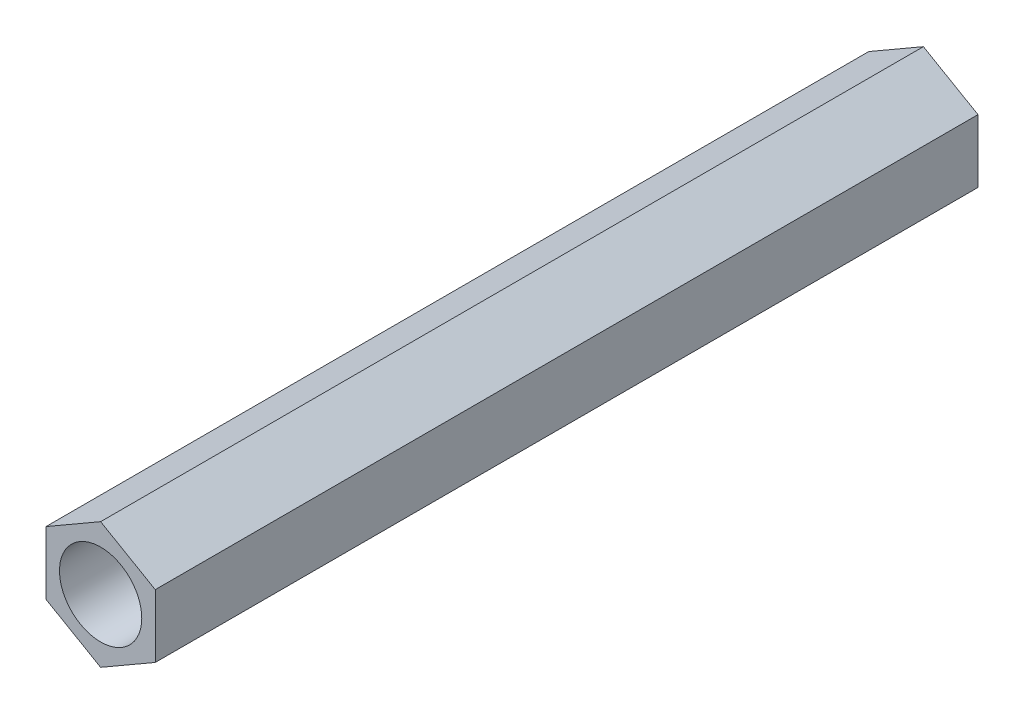
ISO-10303-21;
HEADER;
FILE_DESCRIPTION(('STEP AP214'),'2;1');
FILE_NAME('part.step','',(''),(''),'','','');
FILE_SCHEMA(('AUTOMOTIVE_DESIGN { 1 0 10303 214 1 1 1 1 }'));
ENDSEC;
DATA;
#1=APPLICATION_CONTEXT('core data for automotive mechanical design processes');
#2=APPLICATION_PROTOCOL_DEFINITION('international standard','automotive_design',2000,#1);
#3=PRODUCT_CONTEXT('',#1,'mechanical');
#4=PRODUCT('Part','Part','',(#3));
#5=PRODUCT_RELATED_PRODUCT_CATEGORY('part','',(#4));
#6=PRODUCT_DEFINITION_FORMATION('','',#4);
#7=PRODUCT_DEFINITION_CONTEXT('part definition',#1,'design');
#8=PRODUCT_DEFINITION('design','',#6,#7);
#9=PRODUCT_DEFINITION_SHAPE('','',#8);
#10=(LENGTH_UNIT() NAMED_UNIT(*) SI_UNIT(.MILLI.,.METRE.));
#11=(NAMED_UNIT(*) PLANE_ANGLE_UNIT() SI_UNIT($,.RADIAN.));
#12=(NAMED_UNIT(*) SI_UNIT($,.STERADIAN.) SOLID_ANGLE_UNIT());
#13=UNCERTAINTY_MEASURE_WITH_UNIT(LENGTH_MEASURE(1.E-05),#10,'distance_accuracy_value','');
#14=(GEOMETRIC_REPRESENTATION_CONTEXT(3) GLOBAL_UNCERTAINTY_ASSIGNED_CONTEXT((#13)) GLOBAL_UNIT_ASSIGNED_CONTEXT((#10,
#11,#12)) REPRESENTATION_CONTEXT('',''));
#15=CARTESIAN_POINT('',(0.,0.,0.));
#16=DIRECTION('',(0.,0.,1.));
#17=DIRECTION('',(1.,0.,0.));
#18=AXIS2_PLACEMENT_3D('',#15,#16,#17);
#19=CARTESIAN_POINT('',(0.,0.,30.));
#20=DIRECTION('',(0.,0.,1.));
#21=DIRECTION('',(1.,0.,0.));
#22=AXIS2_PLACEMENT_3D('',#19,#20,#21);
#23=PLANE('',#22);
#24=DIRECTION('',(-0.866025403784439,0.5,0.));
#25=VECTOR('',#24,1.);
#26=CARTESIAN_POINT('',(1.99185842870421,1.15,30.));
#27=LINE('',#26,#25);
#28=CARTESIAN_POINT('',(1.99185842870421,1.15,30.));
#29=VERTEX_POINT('',#28);
#30=CARTESIAN_POINT('',(0.,2.3,30.));
#31=VERTEX_POINT('',#30);
#32=EDGE_CURVE('E137',#29,#31,#27,.T.);
#33=ORIENTED_EDGE('',*,*,#32,.T.);
#34=DIRECTION('',(-0.866025403784439,-0.5,0.));
#35=VECTOR('',#34,1.);
#36=CARTESIAN_POINT('',(0.,2.3,30.));
#37=LINE('',#36,#35);
#38=CARTESIAN_POINT('',(-1.99185842870421,1.15,30.));
#39=VERTEX_POINT('',#38);
#40=EDGE_CURVE('E95',#31,#39,#37,.T.);
#41=ORIENTED_EDGE('',*,*,#40,.T.);
#42=DIRECTION('',(0.,-1.,0.));
#43=VECTOR('',#42,1.);
#44=CARTESIAN_POINT('',(-1.99185842870421,1.15,30.));
#45=LINE('',#44,#43);
#46=CARTESIAN_POINT('',(-1.99185842870421,-1.15,30.));
#47=VERTEX_POINT('',#46);
#48=EDGE_CURVE('E108',#39,#47,#45,.T.);
#49=ORIENTED_EDGE('',*,*,#48,.T.);
#50=DIRECTION('',(0.866025403784439,-0.5,0.));
#51=VECTOR('',#50,1.);
#52=CARTESIAN_POINT('',(-1.99185842870421,-1.15,30.));
#53=LINE('',#52,#51);
#54=CARTESIAN_POINT('',(0.,-2.3,30.));
#55=VERTEX_POINT('',#54);
#56=EDGE_CURVE('E102',#47,#55,#53,.T.);
#57=ORIENTED_EDGE('',*,*,#56,.T.);
#58=DIRECTION('',(0.866025403784439,0.5,0.));
#59=VECTOR('',#58,1.);
#60=CARTESIAN_POINT('',(0.,-2.3,30.));
#61=LINE('',#60,#59);
#62=CARTESIAN_POINT('',(1.99185842870421,-1.15,30.));
#63=VERTEX_POINT('',#62);
#64=EDGE_CURVE('E106',#55,#63,#61,.T.);
#65=ORIENTED_EDGE('',*,*,#64,.T.);
#66=DIRECTION('',(0.,1.,0.));
#67=VECTOR('',#66,1.);
#68=CARTESIAN_POINT('',(1.99185842870421,-1.15,30.));
#69=LINE('',#68,#67);
#70=EDGE_CURVE('E58',#63,#29,#69,.T.);
#71=ORIENTED_EDGE('',*,*,#70,.T.);
#72=EDGE_LOOP('',(#33,#41,#49,#57,#65,#71));
#73=FACE_BOUND('',#72,.T.);
#74=CARTESIAN_POINT('',(0.,0.,30.));
#75=DIRECTION('',(0.,0.,1.));
#76=DIRECTION('',(1.,0.,0.));
#77=AXIS2_PLACEMENT_3D('',#74,#75,#76);
#78=CIRCLE('',#77,1.5);
#79=CARTESIAN_POINT('',(1.5,0.,30.));
#80=VERTEX_POINT('',#79);
#81=EDGE_CURVE('E130',#80,#80,#78,.T.);
#82=ORIENTED_EDGE('',*,*,#81,.F.);
#83=EDGE_LOOP('',(#82));
#84=FACE_BOUND('',#83,.T.);
#85=ADVANCED_FACE('F41',(#73,#84),#23,.T.);
#86=CARTESIAN_POINT('',(0.,0.,0.));
#87=DIRECTION('',(0.,0.,1.));
#88=DIRECTION('',(1.,0.,0.));
#89=AXIS2_PLACEMENT_3D('',#86,#87,#88);
#90=PLANE('',#89);
#91=DIRECTION('',(-0.866025403784439,0.5,0.));
#92=VECTOR('',#91,1.);
#93=CARTESIAN_POINT('',(1.99185842870421,1.15,0.));
#94=LINE('',#93,#92);
#95=CARTESIAN_POINT('',(1.99185842870421,1.15,0.));
#96=VERTEX_POINT('',#95);
#97=CARTESIAN_POINT('',(0.,2.3,0.));
#98=VERTEX_POINT('',#97);
#99=EDGE_CURVE('E126',#96,#98,#94,.T.);
#100=ORIENTED_EDGE('',*,*,#99,.F.);
#101=DIRECTION('',(0.,1.,0.));
#102=VECTOR('',#101,1.);
#103=CARTESIAN_POINT('',(1.99185842870421,-1.15,0.));
#104=LINE('',#103,#102);
#105=CARTESIAN_POINT('',(1.99185842870421,-1.15,0.));
#106=VERTEX_POINT('',#105);
#107=EDGE_CURVE('E87',#106,#96,#104,.T.);
#108=ORIENTED_EDGE('',*,*,#107,.F.);
#109=DIRECTION('',(0.866025403784439,0.5,0.));
#110=VECTOR('',#109,1.);
#111=CARTESIAN_POINT('',(0.,-2.3,0.));
#112=LINE('',#111,#110);
#113=CARTESIAN_POINT('',(0.,-2.3,0.));
#114=VERTEX_POINT('',#113);
#115=EDGE_CURVE('E81',#114,#106,#112,.T.);
#116=ORIENTED_EDGE('',*,*,#115,.F.);
#117=DIRECTION('',(0.866025403784439,-0.5,0.));
#118=VECTOR('',#117,1.);
#119=CARTESIAN_POINT('',(-1.99185842870421,-1.15,0.));
#120=LINE('',#119,#118);
#121=CARTESIAN_POINT('',(-1.99185842870421,-1.15,0.));
#122=VERTEX_POINT('',#121);
#123=EDGE_CURVE('E116',#122,#114,#120,.T.);
#124=ORIENTED_EDGE('',*,*,#123,.F.);
#125=DIRECTION('',(0.,-1.,0.));
#126=VECTOR('',#125,1.);
#127=CARTESIAN_POINT('',(-1.99185842870421,1.15,0.));
#128=LINE('',#127,#126);
#129=CARTESIAN_POINT('',(-1.99185842870421,1.15,0.));
#130=VERTEX_POINT('',#129);
#131=EDGE_CURVE('E132',#130,#122,#128,.T.);
#132=ORIENTED_EDGE('',*,*,#131,.F.);
#133=DIRECTION('',(-0.866025403784439,-0.5,0.));
#134=VECTOR('',#133,1.);
#135=CARTESIAN_POINT('',(0.,2.3,0.));
#136=LINE('',#135,#134);
#137=EDGE_CURVE('E129',#98,#130,#136,.T.);
#138=ORIENTED_EDGE('',*,*,#137,.F.);
#139=EDGE_LOOP('',(#100,#108,#116,#124,#132,#138));
#140=FACE_BOUND('',#139,.T.);
#141=CARTESIAN_POINT('',(0.,0.,0.));
#142=DIRECTION('',(0.,0.,1.));
#143=DIRECTION('',(1.,0.,0.));
#144=AXIS2_PLACEMENT_3D('',#141,#142,#143);
#145=CIRCLE('',#144,1.5);
#146=CARTESIAN_POINT('',(1.5,0.,0.));
#147=VERTEX_POINT('',#146);
#148=EDGE_CURVE('E230',#147,#147,#145,.T.);
#149=ORIENTED_EDGE('',*,*,#148,.T.);
#150=EDGE_LOOP('',(#149));
#151=FACE_BOUND('',#150,.T.);
#152=ADVANCED_FACE('F146',(#140,#151),#90,.F.);
#153=CARTESIAN_POINT('',(1.99185842870421,1.15,30.));
#154=DIRECTION('',(-0.5,-0.866025403784439,0.));
#155=DIRECTION('',(0.866025403784439,-0.5,0.));
#156=AXIS2_PLACEMENT_3D('',#153,#154,#155);
#157=PLANE('',#156);
#158=ORIENTED_EDGE('',*,*,#99,.T.);
#159=DIRECTION('',(0.,0.,-1.));
#160=VECTOR('',#159,1.);
#161=CARTESIAN_POINT('',(0.,2.3,30.));
#162=LINE('',#161,#160);
#163=EDGE_CURVE('E11',#31,#98,#162,.T.);
#164=ORIENTED_EDGE('',*,*,#163,.F.);
#165=ORIENTED_EDGE('',*,*,#32,.F.);
#166=DIRECTION('',(0.,0.,-1.));
#167=VECTOR('',#166,1.);
#168=CARTESIAN_POINT('',(1.99185842870421,1.15,30.));
#169=LINE('',#168,#167);
#170=EDGE_CURVE('E122',#29,#96,#169,.T.);
#171=ORIENTED_EDGE('',*,*,#170,.T.);
#172=EDGE_LOOP('',(#158,#164,#165,#171));
#173=FACE_BOUND('',#172,.T.);
#174=ADVANCED_FACE('F43',(#173),#157,.F.);
#175=CARTESIAN_POINT('',(0.,2.3,30.));
#176=DIRECTION('',(0.5,-0.866025403784439,0.));
#177=DIRECTION('',(0.866025403784439,0.5,0.));
#178=AXIS2_PLACEMENT_3D('',#175,#176,#177);
#179=PLANE('',#178);
#180=ORIENTED_EDGE('',*,*,#137,.T.);
#181=DIRECTION('',(0.,0.,-1.));
#182=VECTOR('',#181,1.);
#183=CARTESIAN_POINT('',(-1.99185842870421,1.15,30.));
#184=LINE('',#183,#182);
#185=EDGE_CURVE('E50',#39,#130,#184,.T.);
#186=ORIENTED_EDGE('',*,*,#185,.F.);
#187=ORIENTED_EDGE('',*,*,#40,.F.);
#188=ORIENTED_EDGE('',*,*,#163,.T.);
#189=EDGE_LOOP('',(#180,#186,#187,#188));
#190=FACE_BOUND('',#189,.T.);
#191=ADVANCED_FACE('F171',(#190),#179,.F.);
#192=CARTESIAN_POINT('',(-1.99185842870421,1.15,30.));
#193=DIRECTION('',(1.,0.,0.));
#194=DIRECTION('',(0.,1.,0.));
#195=AXIS2_PLACEMENT_3D('',#192,#193,#194);
#196=PLANE('',#195);
#197=ORIENTED_EDGE('',*,*,#131,.T.);
#198=DIRECTION('',(0.,0.,-1.));
#199=VECTOR('',#198,1.);
#200=CARTESIAN_POINT('',(-1.99185842870421,-1.15,30.));
#201=LINE('',#200,#199);
#202=EDGE_CURVE('E117',#47,#122,#201,.T.);
#203=ORIENTED_EDGE('',*,*,#202,.F.);
#204=ORIENTED_EDGE('',*,*,#48,.F.);
#205=ORIENTED_EDGE('',*,*,#185,.T.);
#206=EDGE_LOOP('',(#197,#203,#204,#205));
#207=FACE_BOUND('',#206,.T.);
#208=ADVANCED_FACE('F143',(#207),#196,.F.);
#209=CARTESIAN_POINT('',(-1.99185842870421,-1.15,30.));
#210=DIRECTION('',(0.5,0.866025403784439,0.));
#211=DIRECTION('',(-0.866025403784439,0.5,0.));
#212=AXIS2_PLACEMENT_3D('',#209,#210,#211);
#213=PLANE('',#212);
#214=ORIENTED_EDGE('',*,*,#123,.T.);
#215=DIRECTION('',(0.,0.,-1.));
#216=VECTOR('',#215,1.);
#217=CARTESIAN_POINT('',(0.,-2.3,30.));
#218=LINE('',#217,#216);
#219=EDGE_CURVE('E113',#55,#114,#218,.T.);
#220=ORIENTED_EDGE('',*,*,#219,.F.);
#221=ORIENTED_EDGE('',*,*,#56,.F.);
#222=ORIENTED_EDGE('',*,*,#202,.T.);
#223=EDGE_LOOP('',(#214,#220,#221,#222));
#224=FACE_BOUND('',#223,.T.);
#225=ADVANCED_FACE('F114',(#224),#213,.F.);
#226=CARTESIAN_POINT('',(0.,-2.3,30.));
#227=DIRECTION('',(-0.5,0.866025403784439,0.));
#228=DIRECTION('',(-0.866025403784439,-0.5,0.));
#229=AXIS2_PLACEMENT_3D('',#226,#227,#228);
#230=PLANE('',#229);
#231=ORIENTED_EDGE('',*,*,#115,.T.);
#232=DIRECTION('',(0.,0.,-1.));
#233=VECTOR('',#232,1.);
#234=CARTESIAN_POINT('',(1.99185842870421,-1.15,30.));
#235=LINE('',#234,#233);
#236=EDGE_CURVE('E118',#63,#106,#235,.T.);
#237=ORIENTED_EDGE('',*,*,#236,.F.);
#238=ORIENTED_EDGE('',*,*,#64,.F.);
#239=ORIENTED_EDGE('',*,*,#219,.T.);
#240=EDGE_LOOP('',(#231,#237,#238,#239));
#241=FACE_BOUND('',#240,.T.);
#242=ADVANCED_FACE('F120',(#241),#230,.F.);
#243=CARTESIAN_POINT('',(1.99185842870421,-1.15,30.));
#244=DIRECTION('',(-1.,0.,0.));
#245=DIRECTION('',(0.,-1.,0.));
#246=AXIS2_PLACEMENT_3D('',#243,#244,#245);
#247=PLANE('',#246);
#248=ORIENTED_EDGE('',*,*,#107,.T.);
#249=ORIENTED_EDGE('',*,*,#170,.F.);
#250=ORIENTED_EDGE('',*,*,#70,.F.);
#251=ORIENTED_EDGE('',*,*,#236,.T.);
#252=EDGE_LOOP('',(#248,#249,#250,#251));
#253=FACE_BOUND('',#252,.T.);
#254=ADVANCED_FACE('F151',(#253),#247,.F.);
#255=CARTESIAN_POINT('',(0.,0.,30.));
#256=DIRECTION('',(0.,0.,-1.));
#257=DIRECTION('',(-1.,0.,0.));
#258=AXIS2_PLACEMENT_3D('',#255,#256,#257);
#259=CYLINDRICAL_SURFACE('',#258,1.5);
#260=ORIENTED_EDGE('',*,*,#81,.T.);
#261=EDGE_LOOP('',(#260));
#262=FACE_BOUND('',#261,.T.);
#263=ORIENTED_EDGE('',*,*,#148,.F.);
#264=EDGE_LOOP('',(#263));
#265=FACE_BOUND('',#264,.T.);
#266=ADVANCED_FACE('F153',(#262,#265),#259,.F.);
#267=CLOSED_SHELL('',(#85,#152,#174,#191,#208,#225,#242,#254,#266));
#268=MANIFOLD_SOLID_BREP('B2',#267);
#269=ADVANCED_BREP_SHAPE_REPRESENTATION('',(#18,#268),#14);
#270=SHAPE_DEFINITION_REPRESENTATION(#9,#269);
ENDSEC;
END-ISO-10303-21;
